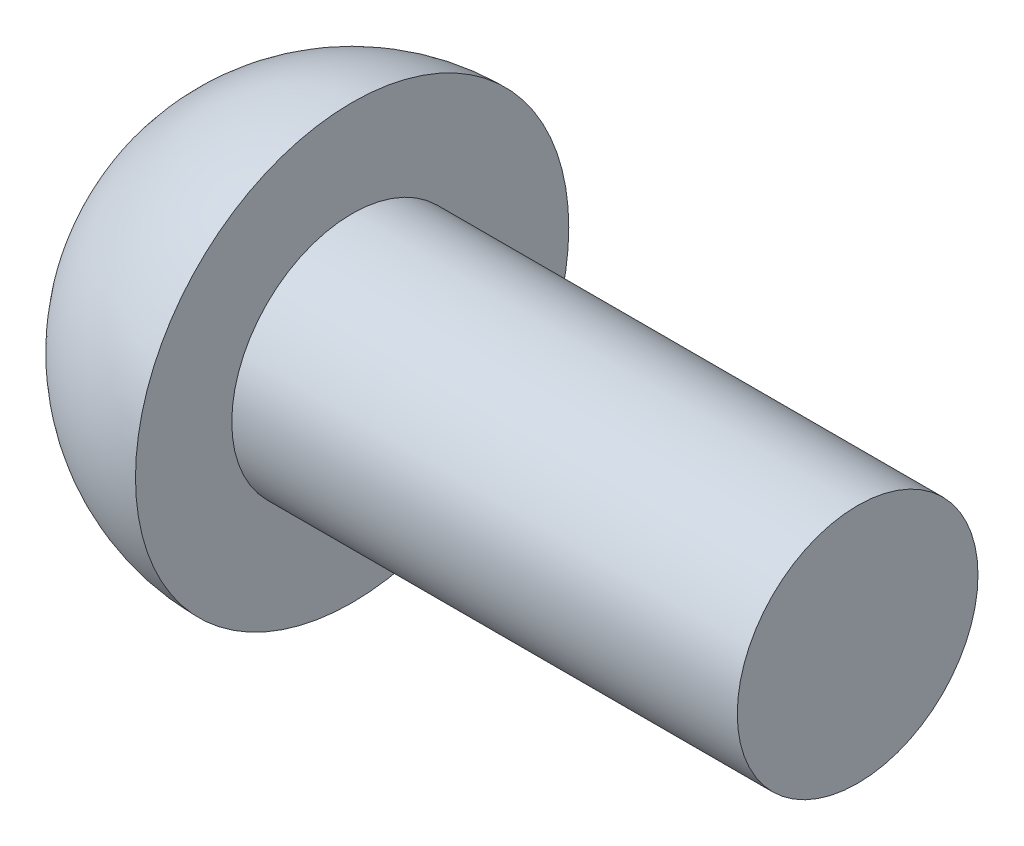
ISO-10303-21;
HEADER;
FILE_DESCRIPTION(('STEP AP214'),'2;1');
FILE_NAME('part.step','',(''),(''),'','','');
FILE_SCHEMA(('AUTOMOTIVE_DESIGN { 1 0 10303 214 1 1 1 1 }'));
ENDSEC;
DATA;
#1=APPLICATION_CONTEXT('core data for automotive mechanical design processes');
#2=APPLICATION_PROTOCOL_DEFINITION('international standard','automotive_design',2000,#1);
#3=PRODUCT_CONTEXT('',#1,'mechanical');
#4=PRODUCT('Part','Part','',(#3));
#5=PRODUCT_RELATED_PRODUCT_CATEGORY('part','',(#4));
#6=PRODUCT_DEFINITION_FORMATION('','',#4);
#7=PRODUCT_DEFINITION_CONTEXT('part definition',#1,'design');
#8=PRODUCT_DEFINITION('design','',#6,#7);
#9=PRODUCT_DEFINITION_SHAPE('','',#8);
#10=(LENGTH_UNIT() NAMED_UNIT(*) SI_UNIT(.MILLI.,.METRE.));
#11=(NAMED_UNIT(*) PLANE_ANGLE_UNIT() SI_UNIT($,.RADIAN.));
#12=(NAMED_UNIT(*) SI_UNIT($,.STERADIAN.) SOLID_ANGLE_UNIT());
#13=UNCERTAINTY_MEASURE_WITH_UNIT(LENGTH_MEASURE(1.E-05),#10,'distance_accuracy_value','');
#14=(GEOMETRIC_REPRESENTATION_CONTEXT(3) GLOBAL_UNCERTAINTY_ASSIGNED_CONTEXT((#13)) GLOBAL_UNIT_ASSIGNED_CONTEXT((#10,
#11,#12)) REPRESENTATION_CONTEXT('',''));
#15=CARTESIAN_POINT('',(0.,0.,0.));
#16=DIRECTION('',(0.,0.,1.));
#17=DIRECTION('',(1.,0.,0.));
#18=AXIS2_PLACEMENT_3D('',#15,#16,#17);
#19=CARTESIAN_POINT('',(0.,0.,0.));
#20=DIRECTION('',(-1.,0.,0.));
#21=DIRECTION('',(0.,0.,1.));
#22=AXIS2_PLACEMENT_3D('',#19,#20,#21);
#23=PLANE('',#22);
#24=CARTESIAN_POINT('',(0.,-5.,0.));
#25=DIRECTION('',(-1.,0.,0.));
#26=DIRECTION('',(0.,0.,1.));
#27=AXIS2_PLACEMENT_3D('',#24,#25,#26);
#28=CIRCLE('',#27,5.);
#29=CARTESIAN_POINT('',(0.,-5.,5.));
#30=VERTEX_POINT('',#29);
#31=EDGE_CURVE('E10',#30,#30,#28,.T.);
#32=ORIENTED_EDGE('',*,*,#31,.F.);
#33=EDGE_LOOP('',(#32));
#34=FACE_BOUND('',#33,.T.);
#35=ADVANCED_FACE('F34',(#34),#23,.F.);
#36=CARTESIAN_POINT('',(-30.,-5.,0.));
#37=DIRECTION('',(-1.,0.,0.));
#38=DIRECTION('',(0.,0.,1.));
#39=AXIS2_PLACEMENT_3D('',#36,#37,#38);
#40=CYLINDRICAL_SURFACE('',#39,5.);
#41=CARTESIAN_POINT('',(-21.,-5.,0.));
#42=DIRECTION('',(-1.,0.,0.));
#43=DIRECTION('',(0.,0.,1.));
#44=AXIS2_PLACEMENT_3D('',#41,#42,#43);
#45=CIRCLE('',#44,5.);
#46=CARTESIAN_POINT('',(-21.,-5.,5.));
#47=VERTEX_POINT('',#46);
#48=EDGE_CURVE('E40',#47,#47,#45,.T.);
#49=ORIENTED_EDGE('',*,*,#48,.F.);
#50=EDGE_LOOP('',(#49));
#51=FACE_BOUND('',#50,.T.);
#52=ORIENTED_EDGE('',*,*,#31,.T.);
#53=EDGE_LOOP('',(#52));
#54=FACE_BOUND('',#53,.T.);
#55=ADVANCED_FACE('F55',(#51,#54),#40,.T.);
#56=CARTESIAN_POINT('',(-21.,0.,0.));
#57=DIRECTION('',(-1.,0.,0.));
#58=DIRECTION('',(0.,0.,1.));
#59=AXIS2_PLACEMENT_3D('',#56,#57,#58);
#60=PLANE('',#59);
#61=CARTESIAN_POINT('',(-21.,-5.,0.));
#62=DIRECTION('',(-1.,0.,0.));
#63=DIRECTION('',(0.,0.,1.));
#64=AXIS2_PLACEMENT_3D('',#61,#62,#63);
#65=CIRCLE('',#64,9.);
#66=CARTESIAN_POINT('',(-21.,-5.,9.));
#67=VERTEX_POINT('',#66);
#68=EDGE_CURVE('E44',#67,#67,#65,.T.);
#69=ORIENTED_EDGE('',*,*,#68,.F.);
#70=EDGE_LOOP('',(#69));
#71=FACE_BOUND('',#70,.T.);
#72=ORIENTED_EDGE('',*,*,#48,.T.);
#73=EDGE_LOOP('',(#72));
#74=FACE_BOUND('',#73,.T.);
#75=ADVANCED_FACE('F53',(#71,#74),#60,.F.);
#76=CARTESIAN_POINT('',(-21.,-5.,0.));
#77=DIRECTION('',(-1.,0.,0.));
#78=DIRECTION('',(0.,1.,0.));
#79=AXIS2_PLACEMENT_3D('',#76,#77,#78);
#80=SPHERICAL_SURFACE('',#79,9.);
#81=ORIENTED_EDGE('',*,*,#68,.T.);
#82=EDGE_LOOP('',(#81));
#83=FACE_BOUND('',#82,.T.);
#84=ADVANCED_FACE('F51',(#83),#80,.T.);
#85=CLOSED_SHELL('',(#35,#55,#75,#84));
#86=MANIFOLD_SOLID_BREP('B2',#85);
#87=ADVANCED_BREP_SHAPE_REPRESENTATION('',(#18,#86),#14);
#88=SHAPE_DEFINITION_REPRESENTATION(#9,#87);
ENDSEC;
END-ISO-10303-21;
